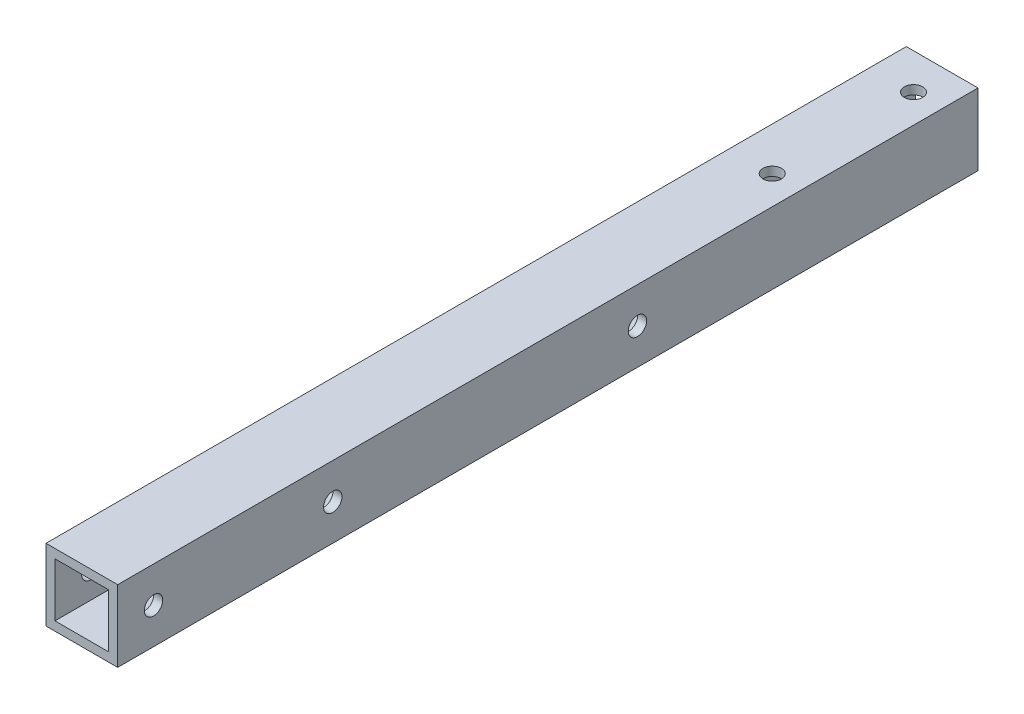
ISO-10303-21;
HEADER;
FILE_DESCRIPTION(('STEP AP214'),'2;1');
FILE_NAME('part.step','',(''),(''),'','','');
FILE_SCHEMA(('AUTOMOTIVE_DESIGN { 1 0 10303 214 1 1 1 1 }'));
ENDSEC;
DATA;
#1=APPLICATION_CONTEXT('core data for automotive mechanical design processes');
#2=APPLICATION_PROTOCOL_DEFINITION('international standard','automotive_design',2000,#1);
#3=PRODUCT_CONTEXT('',#1,'mechanical');
#4=PRODUCT('Part','Part','',(#3));
#5=PRODUCT_RELATED_PRODUCT_CATEGORY('part','',(#4));
#6=PRODUCT_DEFINITION_FORMATION('','',#4);
#7=PRODUCT_DEFINITION_CONTEXT('part definition',#1,'design');
#8=PRODUCT_DEFINITION('design','',#6,#7);
#9=PRODUCT_DEFINITION_SHAPE('','',#8);
#10=(LENGTH_UNIT() NAMED_UNIT(*) SI_UNIT(.MILLI.,.METRE.));
#11=(NAMED_UNIT(*) PLANE_ANGLE_UNIT() SI_UNIT($,.RADIAN.));
#12=(NAMED_UNIT(*) SI_UNIT($,.STERADIAN.) SOLID_ANGLE_UNIT());
#13=UNCERTAINTY_MEASURE_WITH_UNIT(LENGTH_MEASURE(1.E-05),#10,'distance_accuracy_value','');
#14=(GEOMETRIC_REPRESENTATION_CONTEXT(3) GLOBAL_UNCERTAINTY_ASSIGNED_CONTEXT((#13)) GLOBAL_UNIT_ASSIGNED_CONTEXT((#10,
#11,#12)) REPRESENTATION_CONTEXT('',''));
#15=CARTESIAN_POINT('',(0.,0.,0.));
#16=DIRECTION('',(0.,0.,1.));
#17=DIRECTION('',(1.,0.,0.));
#18=AXIS2_PLACEMENT_3D('',#15,#16,#17);
#19=CARTESIAN_POINT('',(0.,0.,304.8));
#20=DIRECTION('',(0.,0.,-1.));
#21=DIRECTION('',(-1.,0.,0.));
#22=AXIS2_PLACEMENT_3D('',#19,#20,#21);
#23=PLANE('',#22);
#24=DIRECTION('',(-1.,0.,0.));
#25=VECTOR('',#24,1.);
#26=CARTESIAN_POINT('',(12.7000000000001,-12.7,304.8));
#27=LINE('',#26,#25);
#28=CARTESIAN_POINT('',(12.7000000000001,-12.7,304.8));
#29=VERTEX_POINT('',#28);
#30=CARTESIAN_POINT('',(-12.6999999999999,-12.7,304.8));
#31=VERTEX_POINT('',#30);
#32=EDGE_CURVE('E142',#29,#31,#27,.T.);
#33=ORIENTED_EDGE('',*,*,#32,.F.);
#34=DIRECTION('',(0.,1.,0.));
#35=VECTOR('',#34,1.);
#36=CARTESIAN_POINT('',(12.7000000000001,-12.7,304.8));
#37=LINE('',#36,#35);
#38=CARTESIAN_POINT('',(12.7000000000001,12.7,304.8));
#39=VERTEX_POINT('',#38);
#40=EDGE_CURVE('E151',#29,#39,#37,.T.);
#41=ORIENTED_EDGE('',*,*,#40,.T.);
#42=DIRECTION('',(-1.,0.,0.));
#43=VECTOR('',#42,1.);
#44=CARTESIAN_POINT('',(12.7000000000001,12.7,304.8));
#45=LINE('',#44,#43);
#46=CARTESIAN_POINT('',(-12.6999999999999,12.7,304.8));
#47=VERTEX_POINT('',#46);
#48=EDGE_CURVE('E149',#39,#47,#45,.T.);
#49=ORIENTED_EDGE('',*,*,#48,.T.);
#50=DIRECTION('',(0.,1.,0.));
#51=VECTOR('',#50,1.);
#52=CARTESIAN_POINT('',(-12.6999999999999,-12.7,304.8));
#53=LINE('',#52,#51);
#54=EDGE_CURVE('E145',#31,#47,#53,.T.);
#55=ORIENTED_EDGE('',*,*,#54,.F.);
#56=EDGE_LOOP('',(#33,#41,#49,#55));
#57=FACE_BOUND('',#56,.T.);
#58=DIRECTION('',(0.,1.,0.));
#59=VECTOR('',#58,1.);
#60=CARTESIAN_POINT('',(9.52500000000005,-9.52499999999999,304.8));
#61=LINE('',#60,#59);
#62=CARTESIAN_POINT('',(9.52500000000005,-9.52499999999999,304.8));
#63=VERTEX_POINT('',#62);
#64=CARTESIAN_POINT('',(9.52500000000005,9.52499999999999,304.8));
#65=VERTEX_POINT('',#64);
#66=EDGE_CURVE('E104',#63,#65,#61,.T.);
#67=ORIENTED_EDGE('',*,*,#66,.F.);
#68=DIRECTION('',(1.,0.,0.));
#69=VECTOR('',#68,1.);
#70=CARTESIAN_POINT('',(-9.52500000000006,-9.52499999999999,304.8));
#71=LINE('',#70,#69);
#72=CARTESIAN_POINT('',(-9.52500000000006,-9.52499999999999,304.8));
#73=VERTEX_POINT('',#72);
#74=EDGE_CURVE('E126',#73,#63,#71,.T.);
#75=ORIENTED_EDGE('',*,*,#74,.F.);
#76=DIRECTION('',(0.,-1.,0.));
#77=VECTOR('',#76,1.);
#78=CARTESIAN_POINT('',(-9.52500000000006,-9.52499999999999,304.8));
#79=LINE('',#78,#77);
#80=CARTESIAN_POINT('',(-9.52500000000006,9.52499999999999,304.8));
#81=VERTEX_POINT('',#80);
#82=EDGE_CURVE('E124',#81,#73,#79,.T.);
#83=ORIENTED_EDGE('',*,*,#82,.F.);
#84=DIRECTION('',(-1.,0.,0.));
#85=VECTOR('',#84,1.);
#86=CARTESIAN_POINT('',(-9.52500000000006,9.52499999999999,304.8));
#87=LINE('',#86,#85);
#88=EDGE_CURVE('E112',#65,#81,#87,.T.);
#89=ORIENTED_EDGE('',*,*,#88,.F.);
#90=EDGE_LOOP('',(#67,#75,#83,#89));
#91=FACE_BOUND('',#90,.T.);
#92=ADVANCED_FACE('F38',(#57,#91),#23,.F.);
#93=CARTESIAN_POINT('',(0.,0.,0.));
#94=DIRECTION('',(0.,0.,-1.));
#95=DIRECTION('',(-1.,0.,0.));
#96=AXIS2_PLACEMENT_3D('',#93,#94,#95);
#97=PLANE('',#96);
#98=DIRECTION('',(-1.,0.,0.));
#99=VECTOR('',#98,1.);
#100=CARTESIAN_POINT('',(12.7000000000001,-12.7,0.));
#101=LINE('',#100,#99);
#102=CARTESIAN_POINT('',(12.7000000000001,-12.7,0.));
#103=VERTEX_POINT('',#102);
#104=CARTESIAN_POINT('',(-12.6999999999999,-12.7,0.));
#105=VERTEX_POINT('',#104);
#106=EDGE_CURVE('E120',#103,#105,#101,.T.);
#107=ORIENTED_EDGE('',*,*,#106,.T.);
#108=DIRECTION('',(0.,1.,0.));
#109=VECTOR('',#108,1.);
#110=CARTESIAN_POINT('',(-12.6999999999999,-12.7,0.));
#111=LINE('',#110,#109);
#112=CARTESIAN_POINT('',(-12.6999999999999,12.7,0.));
#113=VERTEX_POINT('',#112);
#114=EDGE_CURVE('E156',#105,#113,#111,.T.);
#115=ORIENTED_EDGE('',*,*,#114,.T.);
#116=DIRECTION('',(-1.,0.,0.));
#117=VECTOR('',#116,1.);
#118=CARTESIAN_POINT('',(12.7000000000001,12.7,0.));
#119=LINE('',#118,#117);
#120=CARTESIAN_POINT('',(12.7000000000001,12.7,0.));
#121=VERTEX_POINT('',#120);
#122=EDGE_CURVE('E159',#121,#113,#119,.T.);
#123=ORIENTED_EDGE('',*,*,#122,.F.);
#124=DIRECTION('',(0.,1.,0.));
#125=VECTOR('',#124,1.);
#126=CARTESIAN_POINT('',(12.7000000000001,-12.7,0.));
#127=LINE('',#126,#125);
#128=EDGE_CURVE('E146',#103,#121,#127,.T.);
#129=ORIENTED_EDGE('',*,*,#128,.F.);
#130=EDGE_LOOP('',(#107,#115,#123,#129));
#131=FACE_BOUND('',#130,.T.);
#132=DIRECTION('',(1.,0.,0.));
#133=VECTOR('',#132,1.);
#134=CARTESIAN_POINT('',(-9.52500000000006,-9.52499999999999,0.));
#135=LINE('',#134,#133);
#136=CARTESIAN_POINT('',(-9.52500000000006,-9.52499999999999,0.));
#137=VERTEX_POINT('',#136);
#138=CARTESIAN_POINT('',(9.52500000000005,-9.52499999999999,0.));
#139=VERTEX_POINT('',#138);
#140=EDGE_CURVE('E113',#137,#139,#135,.T.);
#141=ORIENTED_EDGE('',*,*,#140,.T.);
#142=DIRECTION('',(0.,1.,0.));
#143=VECTOR('',#142,1.);
#144=CARTESIAN_POINT('',(9.52500000000005,-9.52499999999999,0.));
#145=LINE('',#144,#143);
#146=CARTESIAN_POINT('',(9.52500000000005,9.52499999999999,0.));
#147=VERTEX_POINT('',#146);
#148=EDGE_CURVE('E63',#139,#147,#145,.T.);
#149=ORIENTED_EDGE('',*,*,#148,.T.);
#150=DIRECTION('',(-1.,0.,0.));
#151=VECTOR('',#150,1.);
#152=CARTESIAN_POINT('',(-9.52500000000006,9.52499999999999,0.));
#153=LINE('',#152,#151);
#154=CARTESIAN_POINT('',(-9.52500000000006,9.52499999999999,0.));
#155=VERTEX_POINT('',#154);
#156=EDGE_CURVE('E119',#147,#155,#153,.T.);
#157=ORIENTED_EDGE('',*,*,#156,.T.);
#158=DIRECTION('',(0.,-1.,0.));
#159=VECTOR('',#158,1.);
#160=CARTESIAN_POINT('',(-9.52500000000006,-9.52499999999999,0.));
#161=LINE('',#160,#159);
#162=EDGE_CURVE('E134',#155,#137,#161,.T.);
#163=ORIENTED_EDGE('',*,*,#162,.T.);
#164=EDGE_LOOP('',(#141,#149,#157,#163));
#165=FACE_BOUND('',#164,.T.);
#166=ADVANCED_FACE('F227',(#131,#165),#97,.T.);
#167=CARTESIAN_POINT('',(12.7000000000001,-12.7,304.8));
#168=DIRECTION('',(0.,-1.,0.));
#169=DIRECTION('',(0.,0.,-1.));
#170=AXIS2_PLACEMENT_3D('',#167,#168,#169);
#171=PLANE('',#170);
#172=CARTESIAN_POINT('',(2.54000000000007,-12.7,62.738));
#173=DIRECTION('',(0.,-1.,0.));
#174=DIRECTION('',(0.,0.,-1.));
#175=AXIS2_PLACEMENT_3D('',#172,#173,#174);
#176=CIRCLE('',#175,3.2639);
#177=CARTESIAN_POINT('',(2.54000000000007,-12.7,66.0019));
#178=VERTEX_POINT('',#177);
#179=EDGE_CURVE('E212',#178,#178,#176,.T.);
#180=ORIENTED_EDGE('',*,*,#179,.F.);
#181=EDGE_LOOP('',(#180));
#182=FACE_BOUND('',#181,.T.);
#183=CARTESIAN_POINT('',(2.54000000000007,-12.7,12.7));
#184=DIRECTION('',(0.,-1.,0.));
#185=DIRECTION('',(0.,0.,-1.));
#186=AXIS2_PLACEMENT_3D('',#183,#184,#185);
#187=CIRCLE('',#186,3.2639);
#188=CARTESIAN_POINT('',(2.54000000000007,-12.7,15.9639));
#189=VERTEX_POINT('',#188);
#190=EDGE_CURVE('E132',#189,#189,#187,.T.);
#191=ORIENTED_EDGE('',*,*,#190,.F.);
#192=EDGE_LOOP('',(#191));
#193=FACE_BOUND('',#192,.T.);
#194=ORIENTED_EDGE('',*,*,#106,.F.);
#195=DIRECTION('',(0.,0.,-1.));
#196=VECTOR('',#195,1.);
#197=CARTESIAN_POINT('',(12.7000000000001,-12.7,304.8));
#198=LINE('',#197,#196);
#199=EDGE_CURVE('E11',#29,#103,#198,.T.);
#200=ORIENTED_EDGE('',*,*,#199,.F.);
#201=ORIENTED_EDGE('',*,*,#32,.T.);
#202=DIRECTION('',(0.,0.,-1.));
#203=VECTOR('',#202,1.);
#204=CARTESIAN_POINT('',(-12.6999999999999,-12.7,304.8));
#205=LINE('',#204,#203);
#206=EDGE_CURVE('E153',#31,#105,#205,.T.);
#207=ORIENTED_EDGE('',*,*,#206,.T.);
#208=EDGE_LOOP('',(#194,#200,#201,#207));
#209=FACE_BOUND('',#208,.T.);
#210=ADVANCED_FACE('F40',(#182,#193,#209),#171,.T.);
#211=CARTESIAN_POINT('',(12.7000000000001,-12.7,304.8));
#212=DIRECTION('',(-1.,0.,0.));
#213=DIRECTION('',(0.,0.,1.));
#214=AXIS2_PLACEMENT_3D('',#211,#212,#213);
#215=PLANE('',#214);
#216=CARTESIAN_POINT('',(12.7000000000001,0.,120.65));
#217=DIRECTION('',(-1.,0.,0.));
#218=DIRECTION('',(0.,0.,1.));
#219=AXIS2_PLACEMENT_3D('',#216,#217,#218);
#220=CIRCLE('',#219,3.26390000000001);
#221=CARTESIAN_POINT('',(12.7000000000001,0.,123.9139));
#222=VERTEX_POINT('',#221);
#223=EDGE_CURVE('E273',#222,#222,#220,.T.);
#224=ORIENTED_EDGE('',*,*,#223,.T.);
#225=EDGE_LOOP('',(#224));
#226=FACE_BOUND('',#225,.T.);
#227=CARTESIAN_POINT('',(12.7000000000001,0.,228.6));
#228=DIRECTION('',(1.,0.,0.));
#229=DIRECTION('',(0.,0.,-1.));
#230=AXIS2_PLACEMENT_3D('',#227,#228,#229);
#231=CIRCLE('',#230,3.26389999999998);
#232=CARTESIAN_POINT('',(12.7000000000001,0.,225.3361));
#233=VERTEX_POINT('',#232);
#234=EDGE_CURVE('E192',#233,#233,#231,.T.);
#235=ORIENTED_EDGE('',*,*,#234,.F.);
#236=EDGE_LOOP('',(#235));
#237=FACE_BOUND('',#236,.T.);
#238=CARTESIAN_POINT('',(12.7000000000001,0.,292.1));
#239=DIRECTION('',(-1.,0.,0.));
#240=DIRECTION('',(0.,0.,1.));
#241=AXIS2_PLACEMENT_3D('',#238,#239,#240);
#242=CIRCLE('',#241,3.26390000000001);
#243=CARTESIAN_POINT('',(12.7000000000001,0.,295.3639));
#244=VERTEX_POINT('',#243);
#245=EDGE_CURVE('E181',#244,#244,#242,.T.);
#246=ORIENTED_EDGE('',*,*,#245,.T.);
#247=EDGE_LOOP('',(#246));
#248=FACE_BOUND('',#247,.T.);
#249=ORIENTED_EDGE('',*,*,#128,.T.);
#250=DIRECTION('',(0.,0.,-1.));
#251=VECTOR('',#250,1.);
#252=CARTESIAN_POINT('',(12.7000000000001,12.7,304.8));
#253=LINE('',#252,#251);
#254=EDGE_CURVE('E47',#39,#121,#253,.T.);
#255=ORIENTED_EDGE('',*,*,#254,.F.);
#256=ORIENTED_EDGE('',*,*,#40,.F.);
#257=ORIENTED_EDGE('',*,*,#199,.T.);
#258=EDGE_LOOP('',(#249,#255,#256,#257));
#259=FACE_BOUND('',#258,.T.);
#260=ADVANCED_FACE('F226',(#226,#237,#248,#259),#215,.F.);
#261=CARTESIAN_POINT('',(12.7000000000001,12.7,304.8));
#262=DIRECTION('',(0.,-1.,0.));
#263=DIRECTION('',(0.,0.,-1.));
#264=AXIS2_PLACEMENT_3D('',#261,#262,#263);
#265=PLANE('',#264);
#266=CARTESIAN_POINT('',(2.54000000000007,12.7,62.738));
#267=DIRECTION('',(0.,1.,0.));
#268=DIRECTION('',(0.,0.,1.));
#269=AXIS2_PLACEMENT_3D('',#266,#267,#268);
#270=CIRCLE('',#269,3.2639);
#271=CARTESIAN_POINT('',(2.54000000000007,12.7,66.0019));
#272=VERTEX_POINT('',#271);
#273=EDGE_CURVE('E177',#272,#272,#270,.T.);
#274=ORIENTED_EDGE('',*,*,#273,.F.);
#275=EDGE_LOOP('',(#274));
#276=FACE_BOUND('',#275,.T.);
#277=CARTESIAN_POINT('',(2.54000000000007,12.7,12.7));
#278=DIRECTION('',(0.,1.,0.));
#279=DIRECTION('',(0.,0.,1.));
#280=AXIS2_PLACEMENT_3D('',#277,#278,#279);
#281=CIRCLE('',#280,3.2639);
#282=CARTESIAN_POINT('',(2.54000000000007,12.7,15.9639));
#283=VERTEX_POINT('',#282);
#284=EDGE_CURVE('E172',#283,#283,#281,.T.);
#285=ORIENTED_EDGE('',*,*,#284,.F.);
#286=EDGE_LOOP('',(#285));
#287=FACE_BOUND('',#286,.T.);
#288=ORIENTED_EDGE('',*,*,#122,.T.);
#289=DIRECTION('',(0.,0.,-1.));
#290=VECTOR('',#289,1.);
#291=CARTESIAN_POINT('',(-12.6999999999999,12.7,304.8));
#292=LINE('',#291,#290);
#293=EDGE_CURVE('E165',#47,#113,#292,.T.);
#294=ORIENTED_EDGE('',*,*,#293,.F.);
#295=ORIENTED_EDGE('',*,*,#48,.F.);
#296=ORIENTED_EDGE('',*,*,#254,.T.);
#297=EDGE_LOOP('',(#288,#294,#295,#296));
#298=FACE_BOUND('',#297,.T.);
#299=ADVANCED_FACE('F240',(#276,#287,#298),#265,.F.);
#300=CARTESIAN_POINT('',(-12.6999999999999,-12.7,304.8));
#301=DIRECTION('',(-1.,0.,0.));
#302=DIRECTION('',(0.,0.,1.));
#303=AXIS2_PLACEMENT_3D('',#300,#301,#302);
#304=PLANE('',#303);
#305=CARTESIAN_POINT('',(-12.6999999999999,0.,120.65));
#306=DIRECTION('',(-1.,0.,0.));
#307=DIRECTION('',(0.,0.,1.));
#308=AXIS2_PLACEMENT_3D('',#305,#306,#307);
#309=CIRCLE('',#308,3.26390000000001);
#310=CARTESIAN_POINT('',(-12.6999999999999,0.,123.9139));
#311=VERTEX_POINT('',#310);
#312=EDGE_CURVE('E409',#311,#311,#309,.T.);
#313=ORIENTED_EDGE('',*,*,#312,.F.);
#314=EDGE_LOOP('',(#313));
#315=FACE_BOUND('',#314,.T.);
#316=CARTESIAN_POINT('',(-12.6999999999999,0.,228.6));
#317=DIRECTION('',(1.,0.,0.));
#318=DIRECTION('',(0.,0.,-1.));
#319=AXIS2_PLACEMENT_3D('',#316,#317,#318);
#320=CIRCLE('',#319,3.26389999999998);
#321=CARTESIAN_POINT('',(-12.6999999999999,0.,225.3361));
#322=VERTEX_POINT('',#321);
#323=EDGE_CURVE('E185',#322,#322,#320,.T.);
#324=ORIENTED_EDGE('',*,*,#323,.T.);
#325=EDGE_LOOP('',(#324));
#326=FACE_BOUND('',#325,.T.);
#327=CARTESIAN_POINT('',(-12.6999999999999,0.,292.1));
#328=DIRECTION('',(-1.,0.,0.));
#329=DIRECTION('',(0.,0.,1.));
#330=AXIS2_PLACEMENT_3D('',#327,#328,#329);
#331=CIRCLE('',#330,3.26390000000001);
#332=CARTESIAN_POINT('',(-12.6999999999999,0.,295.3639));
#333=VERTEX_POINT('',#332);
#334=EDGE_CURVE('E189',#333,#333,#331,.T.);
#335=ORIENTED_EDGE('',*,*,#334,.F.);
#336=EDGE_LOOP('',(#335));
#337=FACE_BOUND('',#336,.T.);
#338=ORIENTED_EDGE('',*,*,#114,.F.);
#339=ORIENTED_EDGE('',*,*,#206,.F.);
#340=ORIENTED_EDGE('',*,*,#54,.T.);
#341=ORIENTED_EDGE('',*,*,#293,.T.);
#342=EDGE_LOOP('',(#338,#339,#340,#341));
#343=FACE_BOUND('',#342,.T.);
#344=ADVANCED_FACE('F246',(#315,#326,#337,#343),#304,.T.);
#345=CARTESIAN_POINT('',(9.52500000000005,-9.52499999999999,304.8));
#346=DIRECTION('',(-1.,0.,0.));
#347=DIRECTION('',(0.,0.,1.));
#348=AXIS2_PLACEMENT_3D('',#345,#346,#347);
#349=PLANE('',#348);
#350=CARTESIAN_POINT('',(9.52500000000005,0.,120.65));
#351=DIRECTION('',(-1.,0.,0.));
#352=DIRECTION('',(0.,0.,1.));
#353=AXIS2_PLACEMENT_3D('',#350,#351,#352);
#354=CIRCLE('',#353,3.26390000000001);
#355=CARTESIAN_POINT('',(9.52500000000005,0.,123.9139));
#356=VERTEX_POINT('',#355);
#357=EDGE_CURVE('E197',#356,#356,#354,.T.);
#358=ORIENTED_EDGE('',*,*,#357,.F.);
#359=EDGE_LOOP('',(#358));
#360=FACE_BOUND('',#359,.T.);
#361=CARTESIAN_POINT('',(9.52500000000006,0.,228.6));
#362=DIRECTION('',(-1.,0.,0.));
#363=DIRECTION('',(0.,0.,1.));
#364=AXIS2_PLACEMENT_3D('',#361,#362,#363);
#365=CIRCLE('',#364,3.26389999999998);
#366=CARTESIAN_POINT('',(9.52500000000006,0.,231.8639));
#367=VERTEX_POINT('',#366);
#368=EDGE_CURVE('E184',#367,#367,#365,.T.);
#369=ORIENTED_EDGE('',*,*,#368,.F.);
#370=EDGE_LOOP('',(#369));
#371=FACE_BOUND('',#370,.T.);
#372=CARTESIAN_POINT('',(9.52500000000005,0.,292.1));
#373=DIRECTION('',(-1.,0.,0.));
#374=DIRECTION('',(0.,0.,1.));
#375=AXIS2_PLACEMENT_3D('',#372,#373,#374);
#376=CIRCLE('',#375,3.26390000000001);
#377=CARTESIAN_POINT('',(9.52500000000005,0.,295.3639));
#378=VERTEX_POINT('',#377);
#379=EDGE_CURVE('E180',#378,#378,#376,.T.);
#380=ORIENTED_EDGE('',*,*,#379,.F.);
#381=EDGE_LOOP('',(#380));
#382=FACE_BOUND('',#381,.T.);
#383=ORIENTED_EDGE('',*,*,#148,.F.);
#384=DIRECTION('',(0.,0.,-1.));
#385=VECTOR('',#384,1.);
#386=CARTESIAN_POINT('',(9.52500000000005,-9.52499999999999,304.8));
#387=LINE('',#386,#385);
#388=EDGE_CURVE('E108',#63,#139,#387,.T.);
#389=ORIENTED_EDGE('',*,*,#388,.F.);
#390=ORIENTED_EDGE('',*,*,#66,.T.);
#391=DIRECTION('',(0.,0.,-1.));
#392=VECTOR('',#391,1.);
#393=CARTESIAN_POINT('',(9.52500000000005,9.52499999999999,304.8));
#394=LINE('',#393,#392);
#395=EDGE_CURVE('E107',#65,#147,#394,.T.);
#396=ORIENTED_EDGE('',*,*,#395,.T.);
#397=EDGE_LOOP('',(#383,#389,#390,#396));
#398=FACE_BOUND('',#397,.T.);
#399=ADVANCED_FACE('F106',(#360,#371,#382,#398),#349,.T.);
#400=CARTESIAN_POINT('',(-9.52500000000006,9.52499999999999,304.8));
#401=DIRECTION('',(0.,-1.,0.));
#402=DIRECTION('',(0.,0.,-1.));
#403=AXIS2_PLACEMENT_3D('',#400,#401,#402);
#404=PLANE('',#403);
#405=CARTESIAN_POINT('',(2.54000000000007,9.52499999999995,62.738));
#406=DIRECTION('',(0.,-1.,0.));
#407=DIRECTION('',(0.,0.,-1.));
#408=AXIS2_PLACEMENT_3D('',#405,#406,#407);
#409=CIRCLE('',#408,3.2639);
#410=CARTESIAN_POINT('',(2.54000000000007,9.52499999999995,66.0019));
#411=VERTEX_POINT('',#410);
#412=EDGE_CURVE('E176',#411,#411,#409,.T.);
#413=ORIENTED_EDGE('',*,*,#412,.F.);
#414=EDGE_LOOP('',(#413));
#415=FACE_BOUND('',#414,.T.);
#416=CARTESIAN_POINT('',(2.54000000000007,9.52499999999995,12.7));
#417=DIRECTION('',(0.,-1.,0.));
#418=DIRECTION('',(0.,0.,-1.));
#419=AXIS2_PLACEMENT_3D('',#416,#417,#418);
#420=CIRCLE('',#419,3.2639);
#421=CARTESIAN_POINT('',(2.54000000000007,9.52499999999995,15.9639));
#422=VERTEX_POINT('',#421);
#423=EDGE_CURVE('E171',#422,#422,#420,.T.);
#424=ORIENTED_EDGE('',*,*,#423,.F.);
#425=EDGE_LOOP('',(#424));
#426=FACE_BOUND('',#425,.T.);
#427=ORIENTED_EDGE('',*,*,#156,.F.);
#428=ORIENTED_EDGE('',*,*,#395,.F.);
#429=ORIENTED_EDGE('',*,*,#88,.T.);
#430=DIRECTION('',(0.,0.,-1.));
#431=VECTOR('',#430,1.);
#432=CARTESIAN_POINT('',(-9.52500000000006,9.52499999999999,304.8));
#433=LINE('',#432,#431);
#434=EDGE_CURVE('E121',#81,#155,#433,.T.);
#435=ORIENTED_EDGE('',*,*,#434,.T.);
#436=EDGE_LOOP('',(#427,#428,#429,#435));
#437=FACE_BOUND('',#436,.T.);
#438=ADVANCED_FACE('F116',(#415,#426,#437),#404,.T.);
#439=CARTESIAN_POINT('',(-9.52500000000006,-9.52499999999999,304.8));
#440=DIRECTION('',(1.,0.,0.));
#441=DIRECTION('',(0.,0.,-1.));
#442=AXIS2_PLACEMENT_3D('',#439,#440,#441);
#443=PLANE('',#442);
#444=CARTESIAN_POINT('',(-9.52500000000006,0.,120.65));
#445=DIRECTION('',(1.,0.,0.));
#446=DIRECTION('',(0.,0.,-1.));
#447=AXIS2_PLACEMENT_3D('',#444,#445,#446);
#448=CIRCLE('',#447,3.26390000000001);
#449=CARTESIAN_POINT('',(-9.52500000000006,0.,117.3861));
#450=VERTEX_POINT('',#449);
#451=EDGE_CURVE('E42',#450,#450,#448,.T.);
#452=ORIENTED_EDGE('',*,*,#451,.F.);
#453=EDGE_LOOP('',(#452));
#454=FACE_BOUND('',#453,.T.);
#455=CARTESIAN_POINT('',(-9.52500000000006,0.,228.6));
#456=DIRECTION('',(1.,0.,0.));
#457=DIRECTION('',(0.,0.,-1.));
#458=AXIS2_PLACEMENT_3D('',#455,#456,#457);
#459=CIRCLE('',#458,3.26389999999998);
#460=CARTESIAN_POINT('',(-9.52500000000006,0.,225.3361));
#461=VERTEX_POINT('',#460);
#462=EDGE_CURVE('E182',#461,#461,#459,.T.);
#463=ORIENTED_EDGE('',*,*,#462,.F.);
#464=EDGE_LOOP('',(#463));
#465=FACE_BOUND('',#464,.T.);
#466=CARTESIAN_POINT('',(-9.52500000000006,0.,292.1));
#467=DIRECTION('',(1.,0.,0.));
#468=DIRECTION('',(0.,0.,-1.));
#469=AXIS2_PLACEMENT_3D('',#466,#467,#468);
#470=CIRCLE('',#469,3.26390000000001);
#471=CARTESIAN_POINT('',(-9.52500000000006,0.,288.8361));
#472=VERTEX_POINT('',#471);
#473=EDGE_CURVE('E178',#472,#472,#470,.T.);
#474=ORIENTED_EDGE('',*,*,#473,.F.);
#475=EDGE_LOOP('',(#474));
#476=FACE_BOUND('',#475,.T.);
#477=ORIENTED_EDGE('',*,*,#162,.F.);
#478=ORIENTED_EDGE('',*,*,#434,.F.);
#479=ORIENTED_EDGE('',*,*,#82,.T.);
#480=DIRECTION('',(0.,0.,-1.));
#481=VECTOR('',#480,1.);
#482=CARTESIAN_POINT('',(-9.52500000000006,-9.52499999999999,304.8));
#483=LINE('',#482,#481);
#484=EDGE_CURVE('E55',#73,#137,#483,.T.);
#485=ORIENTED_EDGE('',*,*,#484,.T.);
#486=EDGE_LOOP('',(#477,#478,#479,#485));
#487=FACE_BOUND('',#486,.T.);
#488=ADVANCED_FACE('F304',(#454,#465,#476,#487),#443,.T.);
#489=CARTESIAN_POINT('',(-9.52500000000006,-9.52499999999999,304.8));
#490=DIRECTION('',(0.,1.,0.));
#491=DIRECTION('',(0.,0.,1.));
#492=AXIS2_PLACEMENT_3D('',#489,#490,#491);
#493=PLANE('',#492);
#494=CARTESIAN_POINT('',(2.54000000000007,-9.52500000000006,62.738));
#495=DIRECTION('',(0.,1.,0.));
#496=DIRECTION('',(0.,0.,1.));
#497=AXIS2_PLACEMENT_3D('',#494,#495,#496);
#498=CIRCLE('',#497,3.2639);
#499=CARTESIAN_POINT('',(2.54000000000007,-9.52500000000006,66.0019));
#500=VERTEX_POINT('',#499);
#501=EDGE_CURVE('E173',#500,#500,#498,.T.);
#502=ORIENTED_EDGE('',*,*,#501,.F.);
#503=EDGE_LOOP('',(#502));
#504=FACE_BOUND('',#503,.T.);
#505=CARTESIAN_POINT('',(2.54000000000007,-9.52500000000006,12.7));
#506=DIRECTION('',(0.,1.,0.));
#507=DIRECTION('',(0.,0.,1.));
#508=AXIS2_PLACEMENT_3D('',#505,#506,#507);
#509=CIRCLE('',#508,3.2639);
#510=CARTESIAN_POINT('',(2.54000000000007,-9.52500000000006,15.9639));
#511=VERTEX_POINT('',#510);
#512=EDGE_CURVE('E168',#511,#511,#509,.T.);
#513=ORIENTED_EDGE('',*,*,#512,.F.);
#514=EDGE_LOOP('',(#513));
#515=FACE_BOUND('',#514,.T.);
#516=ORIENTED_EDGE('',*,*,#140,.F.);
#517=ORIENTED_EDGE('',*,*,#484,.F.);
#518=ORIENTED_EDGE('',*,*,#74,.T.);
#519=ORIENTED_EDGE('',*,*,#388,.T.);
#520=EDGE_LOOP('',(#516,#517,#518,#519));
#521=FACE_BOUND('',#520,.T.);
#522=ADVANCED_FACE('F301',(#504,#515,#521),#493,.T.);
#523=CARTESIAN_POINT('',(2.54000000000007,-292.1,12.7));
#524=DIRECTION('',(0.,1.,0.));
#525=DIRECTION('',(0.,0.,1.));
#526=AXIS2_PLACEMENT_3D('',#523,#524,#525);
#527=CYLINDRICAL_SURFACE('',#526,3.2639);
#528=CARTESIAN_POINT('',(2.54000000000007,-12.7,15.9639));
#529=CARTESIAN_POINT('',(2.54000000000007,-12.6669270833333,15.9639));
#530=CARTESIAN_POINT('',(2.54000000000007,-12.6338541666666,15.9639));
#531=CARTESIAN_POINT('',(2.54000000000007,-12.5677083333333,15.9639));
#532=CARTESIAN_POINT('',(2.54000000000007,-12.5346354166667,15.9639));
#533=CARTESIAN_POINT('',(2.54000000000007,-12.4684895833333,15.9639));
#534=CARTESIAN_POINT('',(2.54000000000007,-12.4354166666667,15.9639));
#535=CARTESIAN_POINT('',(2.54000000000007,-12.3692708333333,15.9639));
#536=CARTESIAN_POINT('',(2.54000000000007,-12.3361979166667,15.9639));
#537=CARTESIAN_POINT('',(2.54000000000007,-12.2700520833334,15.9639));
#538=CARTESIAN_POINT('',(2.54000000000007,-12.2369791666667,15.9639));
#539=CARTESIAN_POINT('',(2.54000000000007,-12.1708333333333,15.9639));
#540=CARTESIAN_POINT('',(2.54000000000007,-12.1377604166667,15.9639));
#541=CARTESIAN_POINT('',(2.54000000000007,-12.0716145833333,15.9639));
#542=CARTESIAN_POINT('',(2.54000000000007,-12.0385416666667,15.9639));
#543=CARTESIAN_POINT('',(2.54000000000007,-11.9723958333334,15.9639));
#544=CARTESIAN_POINT('',(2.54000000000007,-11.9393229166667,15.9639));
#545=CARTESIAN_POINT('',(2.54000000000007,-11.8731770833333,15.9639));
#546=CARTESIAN_POINT('',(2.54000000000007,-11.8401041666667,15.9639));
#547=CARTESIAN_POINT('',(2.54000000000007,-11.7739583333333,15.9639));
#548=CARTESIAN_POINT('',(2.54000000000007,-11.7408854166667,15.9639));
#549=CARTESIAN_POINT('',(2.54000000000007,-11.6747395833334,15.9639));
#550=CARTESIAN_POINT('',(2.54000000000007,-11.6416666666667,15.9639));
#551=CARTESIAN_POINT('',(2.54000000000007,-11.5755208333333,15.9639));
#552=CARTESIAN_POINT('',(2.54000000000007,-11.5424479166667,15.9639));
#553=CARTESIAN_POINT('',(2.54000000000007,-11.4763020833333,15.9639));
#554=CARTESIAN_POINT('',(2.54000000000007,-11.4432291666667,15.9639));
#555=CARTESIAN_POINT('',(2.54000000000007,-11.3770833333334,15.9639));
#556=CARTESIAN_POINT('',(2.54000000000007,-11.3440104166667,15.9639));
#557=CARTESIAN_POINT('',(2.54000000000007,-11.2778645833334,15.9639));
#558=CARTESIAN_POINT('',(2.54000000000007,-11.2447916666667,15.9639));
#559=CARTESIAN_POINT('',(2.54000000000007,-11.1786458333334,15.9639));
#560=CARTESIAN_POINT('',(2.54000000000007,-11.1455729166667,15.9639));
#561=CARTESIAN_POINT('',(2.54000000000007,-11.0794270833334,15.9639));
#562=CARTESIAN_POINT('',(2.54000000000007,-11.0463541666667,15.9639));
#563=CARTESIAN_POINT('',(2.54000000000007,-10.9802083333334,15.9639));
#564=CARTESIAN_POINT('',(2.54000000000007,-10.9471354166667,15.9639));
#565=CARTESIAN_POINT('',(2.54000000000007,-10.8809895833334,15.9639));
#566=CARTESIAN_POINT('',(2.54000000000007,-10.8479166666667,15.9639));
#567=CARTESIAN_POINT('',(2.54000000000007,-10.7817708333334,15.9639));
#568=CARTESIAN_POINT('',(2.54000000000007,-10.7486979166667,15.9639));
#569=CARTESIAN_POINT('',(2.54000000000007,-10.6825520833334,15.9639));
#570=CARTESIAN_POINT('',(2.54000000000007,-10.6494791666667,15.9639));
#571=CARTESIAN_POINT('',(2.54000000000007,-10.5833333333334,15.9639));
#572=CARTESIAN_POINT('',(2.54000000000007,-10.5502604166667,15.9639));
#573=CARTESIAN_POINT('',(2.54000000000007,-10.4841145833334,15.9639));
#574=CARTESIAN_POINT('',(2.54000000000007,-10.4510416666667,15.9639));
#575=CARTESIAN_POINT('',(2.54000000000007,-10.3848958333334,15.9639));
#576=CARTESIAN_POINT('',(2.54000000000007,-10.3518229166667,15.9639));
#577=CARTESIAN_POINT('',(2.54000000000007,-10.2856770833334,15.9639));
#578=CARTESIAN_POINT('',(2.54000000000007,-10.2526041666667,15.9639));
#579=CARTESIAN_POINT('',(2.54000000000007,-10.1864583333334,15.9639));
#580=CARTESIAN_POINT('',(2.54000000000007,-10.1533854166667,15.9639));
#581=CARTESIAN_POINT('',(2.54000000000007,-10.0872395833334,15.9639));
#582=CARTESIAN_POINT('',(2.54000000000007,-10.0541666666667,15.9639));
#583=CARTESIAN_POINT('',(2.54000000000007,-9.98802083333337,15.9639));
#584=CARTESIAN_POINT('',(2.54000000000007,-9.9549479166667,15.9639));
#585=CARTESIAN_POINT('',(2.54000000000007,-9.88880208333337,15.9639));
#586=CARTESIAN_POINT('',(2.54000000000007,-9.85572916666672,15.9639));
#587=CARTESIAN_POINT('',(2.54000000000007,-9.78958333333339,15.9639));
#588=CARTESIAN_POINT('',(2.54000000000007,-9.75651041666672,15.9639));
#589=CARTESIAN_POINT('',(2.54000000000007,-9.69036458333339,15.9639));
#590=CARTESIAN_POINT('',(2.54000000000007,-9.65729166666673,15.9639));
#591=CARTESIAN_POINT('',(2.54000000000007,-9.59114583333341,15.9639));
#592=CARTESIAN_POINT('',(2.54000000000007,-9.55807291666673,15.9639));
#593=CARTESIAN_POINT('',(2.54000000000007,-9.52500000000006,15.9639));
#594=B_SPLINE_CURVE_WITH_KNOTS('',3,(#528,#529,#530,#531,#532,#533,#534,#535,#536,#537,#538,
#539,#540,#541,#542,#543,#544,#545,#546,#547,#548,#549,#550,#551,#552,#553,#554,#555,#556,#557,
#558,#559,#560,#561,#562,#563,#564,#565,#566,#567,#568,#569,#570,#571,#572,#573,#574,#575,#576,
#577,#578,#579,#580,#581,#582,#583,#584,#585,#586,#587,#588,#589,#590,#591,#592,#593),
.UNSPECIFIED.,.F.,.F.,(4,2,2,2,2,2,2,2,2,2,2,2,2,2,2,2,2,2,2,2,2,2,2,2,2,2,2,2,2,2,2,2,4),(0.,
0.0992187500000186,0.198437499999982,0.29765625,0.396874999999963,0.496093749999982,0.5953125,
0.694531249999963,0.793749999999982,0.892968750000001,0.992187499999964,1.09140624999998,
1.190625,1.28984374999996,1.38906249999998,1.48828124999995,1.58749999999996,1.68671874999998,
1.78593749999995,1.88515624999996,1.98437499999993,2.08359374999995,2.18281249999996,
2.28203124999993,2.38124999999995,2.48046874999996,2.57968749999993,2.67890624999995,
2.77812499999996,2.87734374999993,2.97656249999995,3.07578124999991,3.17499999999993),.UNSPECIFIED.);
#595=EDGE_CURVE('BSEAM221',#189,#511,#594,.T.);
#596=ORIENTED_EDGE('',*,*,#190,.T.);
#597=ORIENTED_EDGE('',*,*,#512,.T.);
#598=ORIENTED_EDGE('',*,*,#595,.T.);
#599=ORIENTED_EDGE('',*,*,#595,.F.);
#600=EDGE_LOOP('',(#596,#598,#597,#599));
#601=FACE_BOUND('',#600,.T.);
#602=ADVANCED_FACE('F221',(#601),#527,.F.);
#603=CARTESIAN_POINT('',(2.54000000000007,9.52499999999995,15.9639));
#604=CARTESIAN_POINT('',(2.54000000000007,9.55807291666662,15.9639));
#605=CARTESIAN_POINT('',(2.54000000000007,9.59114583333329,15.9639));
#606=CARTESIAN_POINT('',(2.54000000000007,9.65729166666662,15.9639));
#607=CARTESIAN_POINT('',(2.54000000000007,9.69036458333328,15.9639));
#608=CARTESIAN_POINT('',(2.54000000000007,9.75651041666661,15.9639));
#609=CARTESIAN_POINT('',(2.54000000000007,9.78958333333328,15.9639));
#610=CARTESIAN_POINT('',(2.54000000000007,9.85572916666662,15.9639));
#611=CARTESIAN_POINT('',(2.54000000000007,9.8888020833333,15.9639));
#612=CARTESIAN_POINT('',(2.54000000000007,9.95494791666662,15.9639));
#613=CARTESIAN_POINT('',(2.54000000000007,9.98802083333328,15.9639));
#614=CARTESIAN_POINT('',(2.54000000000007,10.0541666666666,15.9639));
#615=CARTESIAN_POINT('',(2.54000000000007,10.0872395833333,15.9639));
#616=CARTESIAN_POINT('',(2.54000000000007,10.1533854166666,15.9639));
#617=CARTESIAN_POINT('',(2.54000000000007,10.1864583333333,15.9639));
#618=CARTESIAN_POINT('',(2.54000000000007,10.2526041666666,15.9639));
#619=CARTESIAN_POINT('',(2.54000000000007,10.2856770833333,15.9639));
#620=CARTESIAN_POINT('',(2.54000000000007,10.3518229166666,15.9639));
#621=CARTESIAN_POINT('',(2.54000000000007,10.3848958333333,15.9639));
#622=CARTESIAN_POINT('',(2.54000000000007,10.4510416666666,15.9639));
#623=CARTESIAN_POINT('',(2.54000000000007,10.4841145833333,15.9639));
#624=CARTESIAN_POINT('',(2.54000000000007,10.5502604166666,15.9639));
#625=CARTESIAN_POINT('',(2.54000000000007,10.5833333333333,15.9639));
#626=CARTESIAN_POINT('',(2.54000000000007,10.6494791666666,15.9639));
#627=CARTESIAN_POINT('',(2.54000000000007,10.6825520833333,15.9639));
#628=CARTESIAN_POINT('',(2.54000000000007,10.7486979166666,15.9639));
#629=CARTESIAN_POINT('',(2.54000000000007,10.7817708333333,15.9639));
#630=CARTESIAN_POINT('',(2.54000000000007,10.8479166666666,15.9639));
#631=CARTESIAN_POINT('',(2.54000000000007,10.8809895833333,15.9639));
#632=CARTESIAN_POINT('',(2.54000000000007,10.9471354166666,15.9639));
#633=CARTESIAN_POINT('',(2.54000000000007,10.9802083333333,15.9639));
#634=CARTESIAN_POINT('',(2.54000000000007,11.0463541666666,15.9639));
#635=CARTESIAN_POINT('',(2.54000000000007,11.0794270833333,15.9639));
#636=CARTESIAN_POINT('',(2.54000000000007,11.1455729166666,15.9639));
#637=CARTESIAN_POINT('',(2.54000000000007,11.1786458333333,15.9639));
#638=CARTESIAN_POINT('',(2.54000000000007,11.2447916666666,15.9639));
#639=CARTESIAN_POINT('',(2.54000000000007,11.2778645833333,15.9639));
#640=CARTESIAN_POINT('',(2.54000000000007,11.3440104166666,15.9639));
#641=CARTESIAN_POINT('',(2.54000000000007,11.3770833333333,15.9639));
#642=CARTESIAN_POINT('',(2.54000000000007,11.4432291666666,15.9639));
#643=CARTESIAN_POINT('',(2.54000000000007,11.4763020833333,15.9639));
#644=CARTESIAN_POINT('',(2.54000000000007,11.5424479166666,15.9639));
#645=CARTESIAN_POINT('',(2.54000000000007,11.5755208333333,15.9639));
#646=CARTESIAN_POINT('',(2.54000000000007,11.6416666666666,15.9639));
#647=CARTESIAN_POINT('',(2.54000000000007,11.6747395833333,15.9639));
#648=CARTESIAN_POINT('',(2.54000000000007,11.7408854166666,15.9639));
#649=CARTESIAN_POINT('',(2.54000000000007,11.7739583333333,15.9639));
#650=CARTESIAN_POINT('',(2.54000000000007,11.8401041666666,15.9639));
#651=CARTESIAN_POINT('',(2.54000000000007,11.8731770833333,15.9639));
#652=CARTESIAN_POINT('',(2.54000000000007,11.9393229166666,15.9639));
#653=CARTESIAN_POINT('',(2.54000000000007,11.9723958333333,15.9639));
#654=CARTESIAN_POINT('',(2.54000000000007,12.0385416666666,15.9639));
#655=CARTESIAN_POINT('',(2.54000000000007,12.0716145833333,15.9639));
#656=CARTESIAN_POINT('',(2.54000000000007,12.1377604166667,15.9639));
#657=CARTESIAN_POINT('',(2.54000000000007,12.1708333333333,15.9639));
#658=CARTESIAN_POINT('',(2.54000000000007,12.2369791666667,15.9639));
#659=CARTESIAN_POINT('',(2.54000000000007,12.2700520833333,15.9639));
#660=CARTESIAN_POINT('',(2.54000000000007,12.3361979166666,15.9639));
#661=CARTESIAN_POINT('',(2.54000000000007,12.3692708333333,15.9639));
#662=CARTESIAN_POINT('',(2.54000000000007,12.4354166666667,15.9639));
#663=CARTESIAN_POINT('',(2.54000000000007,12.4684895833333,15.9639));
#664=CARTESIAN_POINT('',(2.54000000000007,12.5346354166667,15.9639));
#665=CARTESIAN_POINT('',(2.54000000000007,12.5677083333333,15.9639));
#666=CARTESIAN_POINT('',(2.54000000000007,12.6338541666666,15.9639));
#667=CARTESIAN_POINT('',(2.54000000000007,12.6669270833333,15.9639));
#668=CARTESIAN_POINT('',(2.54000000000007,12.7,15.9639));
#669=B_SPLINE_CURVE_WITH_KNOTS('',3,(#603,#604,#605,#606,#607,#608,#609,#610,#611,#612,#613,
#614,#615,#616,#617,#618,#619,#620,#621,#622,#623,#624,#625,#626,#627,#628,#629,#630,#631,#632,
#633,#634,#635,#636,#637,#638,#639,#640,#641,#642,#643,#644,#645,#646,#647,#648,#649,#650,#651,
#652,#653,#654,#655,#656,#657,#658,#659,#660,#661,#662,#663,#664,#665,#666,#667,#668),
.UNSPECIFIED.,.F.,.F.,(4,2,2,2,2,2,2,2,2,2,2,2,2,2,2,2,2,2,2,2,2,2,2,2,2,2,2,2,2,2,2,2,4),(0.,
0.0992187500000186,0.198437499999982,0.29765625,0.396875000000019,0.496093749999982,0.5953125,
0.694531250000019,0.793750000000037,0.892968750000001,0.992187500000019,1.09140625000004,
1.190625,1.28984375000002,1.38906250000004,1.48828125,1.58750000000002,1.68671875000004,
1.7859375,1.88515625000002,1.98437500000004,2.08359375,2.18281250000002,2.28203125000004,
2.38125,2.48046875000002,2.57968750000004,2.67890625000006,2.77812500000002,2.87734375000004,
2.97656250000006,3.07578125000002,3.17500000000004),.UNSPECIFIED.);
#670=EDGE_CURVE('BSEAM297',#422,#283,#669,.T.);
#671=ORIENTED_EDGE('',*,*,#423,.T.);
#672=ORIENTED_EDGE('',*,*,#284,.T.);
#673=ORIENTED_EDGE('',*,*,#670,.T.);
#674=ORIENTED_EDGE('',*,*,#670,.F.);
#675=EDGE_LOOP('',(#671,#673,#672,#674));
#676=FACE_BOUND('',#675,.T.);
#677=ADVANCED_FACE('F297',(#676),#527,.F.);
#678=CARTESIAN_POINT('',(2.54000000000007,-292.1,62.738));
#679=DIRECTION('',(0.,1.,0.));
#680=DIRECTION('',(0.,0.,1.));
#681=AXIS2_PLACEMENT_3D('',#678,#679,#680);
#682=CYLINDRICAL_SURFACE('',#681,3.2639);
#683=CARTESIAN_POINT('',(2.54000000000007,-12.7,66.0019));
#684=CARTESIAN_POINT('',(2.54000000000007,-12.6669270833333,66.0019));
#685=CARTESIAN_POINT('',(2.54000000000007,-12.6338541666666,66.0019));
#686=CARTESIAN_POINT('',(2.54000000000007,-12.5677083333333,66.0019));
#687=CARTESIAN_POINT('',(2.54000000000007,-12.5346354166667,66.0019));
#688=CARTESIAN_POINT('',(2.54000000000007,-12.4684895833333,66.0019));
#689=CARTESIAN_POINT('',(2.54000000000007,-12.4354166666667,66.0019));
#690=CARTESIAN_POINT('',(2.54000000000007,-12.3692708333333,66.0019));
#691=CARTESIAN_POINT('',(2.54000000000007,-12.3361979166667,66.0019));
#692=CARTESIAN_POINT('',(2.54000000000007,-12.2700520833334,66.0019));
#693=CARTESIAN_POINT('',(2.54000000000007,-12.2369791666667,66.0019));
#694=CARTESIAN_POINT('',(2.54000000000007,-12.1708333333333,66.0019));
#695=CARTESIAN_POINT('',(2.54000000000007,-12.1377604166667,66.0019));
#696=CARTESIAN_POINT('',(2.54000000000007,-12.0716145833333,66.0019));
#697=CARTESIAN_POINT('',(2.54000000000007,-12.0385416666667,66.0019));
#698=CARTESIAN_POINT('',(2.54000000000007,-11.9723958333334,66.0019));
#699=CARTESIAN_POINT('',(2.54000000000007,-11.9393229166667,66.0019));
#700=CARTESIAN_POINT('',(2.54000000000007,-11.8731770833333,66.0019));
#701=CARTESIAN_POINT('',(2.54000000000007,-11.8401041666667,66.0019));
#702=CARTESIAN_POINT('',(2.54000000000007,-11.7739583333333,66.0019));
#703=CARTESIAN_POINT('',(2.54000000000007,-11.7408854166667,66.0019));
#704=CARTESIAN_POINT('',(2.54000000000007,-11.6747395833334,66.0019));
#705=CARTESIAN_POINT('',(2.54000000000007,-11.6416666666667,66.0019));
#706=CARTESIAN_POINT('',(2.54000000000007,-11.5755208333333,66.0019));
#707=CARTESIAN_POINT('',(2.54000000000007,-11.5424479166667,66.0019));
#708=CARTESIAN_POINT('',(2.54000000000007,-11.4763020833333,66.0019));
#709=CARTESIAN_POINT('',(2.54000000000007,-11.4432291666667,66.0019));
#710=CARTESIAN_POINT('',(2.54000000000007,-11.3770833333334,66.0019));
#711=CARTESIAN_POINT('',(2.54000000000007,-11.3440104166667,66.0019));
#712=CARTESIAN_POINT('',(2.54000000000007,-11.2778645833334,66.0019));
#713=CARTESIAN_POINT('',(2.54000000000007,-11.2447916666667,66.0019));
#714=CARTESIAN_POINT('',(2.54000000000007,-11.1786458333334,66.0019));
#715=CARTESIAN_POINT('',(2.54000000000007,-11.1455729166667,66.0019));
#716=CARTESIAN_POINT('',(2.54000000000007,-11.0794270833334,66.0019));
#717=CARTESIAN_POINT('',(2.54000000000007,-11.0463541666667,66.0019));
#718=CARTESIAN_POINT('',(2.54000000000007,-10.9802083333334,66.0019));
#719=CARTESIAN_POINT('',(2.54000000000007,-10.9471354166667,66.0019));
#720=CARTESIAN_POINT('',(2.54000000000007,-10.8809895833334,66.0019));
#721=CARTESIAN_POINT('',(2.54000000000007,-10.8479166666667,66.0019));
#722=CARTESIAN_POINT('',(2.54000000000007,-10.7817708333334,66.0019));
#723=CARTESIAN_POINT('',(2.54000000000007,-10.7486979166667,66.0019));
#724=CARTESIAN_POINT('',(2.54000000000007,-10.6825520833334,66.0019));
#725=CARTESIAN_POINT('',(2.54000000000007,-10.6494791666667,66.0019));
#726=CARTESIAN_POINT('',(2.54000000000007,-10.5833333333334,66.0019));
#727=CARTESIAN_POINT('',(2.54000000000007,-10.5502604166667,66.0019));
#728=CARTESIAN_POINT('',(2.54000000000007,-10.4841145833334,66.0019));
#729=CARTESIAN_POINT('',(2.54000000000007,-10.4510416666667,66.0019));
#730=CARTESIAN_POINT('',(2.54000000000007,-10.3848958333334,66.0019));
#731=CARTESIAN_POINT('',(2.54000000000007,-10.3518229166667,66.0019));
#732=CARTESIAN_POINT('',(2.54000000000007,-10.2856770833334,66.0019));
#733=CARTESIAN_POINT('',(2.54000000000007,-10.2526041666667,66.0019));
#734=CARTESIAN_POINT('',(2.54000000000007,-10.1864583333334,66.0019));
#735=CARTESIAN_POINT('',(2.54000000000007,-10.1533854166667,66.0019));
#736=CARTESIAN_POINT('',(2.54000000000007,-10.0872395833334,66.0019));
#737=CARTESIAN_POINT('',(2.54000000000007,-10.0541666666667,66.0019));
#738=CARTESIAN_POINT('',(2.54000000000007,-9.98802083333337,66.0019));
#739=CARTESIAN_POINT('',(2.54000000000007,-9.9549479166667,66.0019));
#740=CARTESIAN_POINT('',(2.54000000000007,-9.88880208333337,66.0019));
#741=CARTESIAN_POINT('',(2.54000000000007,-9.85572916666672,66.0019));
#742=CARTESIAN_POINT('',(2.54000000000007,-9.78958333333339,66.0019));
#743=CARTESIAN_POINT('',(2.54000000000007,-9.75651041666672,66.0019));
#744=CARTESIAN_POINT('',(2.54000000000007,-9.69036458333339,66.0019));
#745=CARTESIAN_POINT('',(2.54000000000007,-9.65729166666673,66.0019));
#746=CARTESIAN_POINT('',(2.54000000000007,-9.59114583333341,66.0019));
#747=CARTESIAN_POINT('',(2.54000000000007,-9.55807291666673,66.0019));
#748=CARTESIAN_POINT('',(2.54000000000007,-9.52500000000006,66.0019));
#749=B_SPLINE_CURVE_WITH_KNOTS('',3,(#683,#684,#685,#686,#687,#688,#689,#690,#691,#692,#693,
#694,#695,#696,#697,#698,#699,#700,#701,#702,#703,#704,#705,#706,#707,#708,#709,#710,#711,#712,
#713,#714,#715,#716,#717,#718,#719,#720,#721,#722,#723,#724,#725,#726,#727,#728,#729,#730,#731,
#732,#733,#734,#735,#736,#737,#738,#739,#740,#741,#742,#743,#744,#745,#746,#747,#748),
.UNSPECIFIED.,.F.,.F.,(4,2,2,2,2,2,2,2,2,2,2,2,2,2,2,2,2,2,2,2,2,2,2,2,2,2,2,2,2,2,2,2,4),(0.,
0.0992187500000186,0.198437499999982,0.29765625,0.396874999999963,0.496093749999982,0.5953125,
0.694531249999963,0.793749999999982,0.892968750000001,0.992187499999964,1.09140624999998,
1.190625,1.28984374999996,1.38906249999998,1.48828124999995,1.58749999999996,1.68671874999998,
1.78593749999995,1.88515624999996,1.98437499999993,2.08359374999995,2.18281249999996,
2.28203124999993,2.38124999999995,2.48046874999996,2.57968749999993,2.67890624999995,
2.77812499999996,2.87734374999993,2.97656249999995,3.07578124999991,3.17499999999993),.UNSPECIFIED.);
#750=EDGE_CURVE('BSEAM294',#178,#500,#749,.T.);
#751=ORIENTED_EDGE('',*,*,#179,.T.);
#752=ORIENTED_EDGE('',*,*,#501,.T.);
#753=ORIENTED_EDGE('',*,*,#750,.T.);
#754=ORIENTED_EDGE('',*,*,#750,.F.);
#755=EDGE_LOOP('',(#751,#753,#752,#754));
#756=FACE_BOUND('',#755,.T.);
#757=ADVANCED_FACE('F294',(#756),#682,.F.);
#758=CARTESIAN_POINT('',(2.54000000000007,9.52499999999995,66.0019));
#759=CARTESIAN_POINT('',(2.54000000000007,9.55807291666662,66.0019));
#760=CARTESIAN_POINT('',(2.54000000000007,9.59114583333329,66.0019));
#761=CARTESIAN_POINT('',(2.54000000000007,9.65729166666662,66.0019));
#762=CARTESIAN_POINT('',(2.54000000000007,9.69036458333328,66.0019));
#763=CARTESIAN_POINT('',(2.54000000000007,9.75651041666661,66.0019));
#764=CARTESIAN_POINT('',(2.54000000000007,9.78958333333328,66.0019));
#765=CARTESIAN_POINT('',(2.54000000000007,9.85572916666662,66.0019));
#766=CARTESIAN_POINT('',(2.54000000000007,9.8888020833333,66.0019));
#767=CARTESIAN_POINT('',(2.54000000000007,9.95494791666662,66.0019));
#768=CARTESIAN_POINT('',(2.54000000000007,9.98802083333328,66.0019));
#769=CARTESIAN_POINT('',(2.54000000000007,10.0541666666666,66.0019));
#770=CARTESIAN_POINT('',(2.54000000000007,10.0872395833333,66.0019));
#771=CARTESIAN_POINT('',(2.54000000000007,10.1533854166666,66.0019));
#772=CARTESIAN_POINT('',(2.54000000000007,10.1864583333333,66.0019));
#773=CARTESIAN_POINT('',(2.54000000000007,10.2526041666666,66.0019));
#774=CARTESIAN_POINT('',(2.54000000000007,10.2856770833333,66.0019));
#775=CARTESIAN_POINT('',(2.54000000000007,10.3518229166666,66.0019));
#776=CARTESIAN_POINT('',(2.54000000000007,10.3848958333333,66.0019));
#777=CARTESIAN_POINT('',(2.54000000000007,10.4510416666666,66.0019));
#778=CARTESIAN_POINT('',(2.54000000000007,10.4841145833333,66.0019));
#779=CARTESIAN_POINT('',(2.54000000000007,10.5502604166666,66.0019));
#780=CARTESIAN_POINT('',(2.54000000000007,10.5833333333333,66.0019));
#781=CARTESIAN_POINT('',(2.54000000000007,10.6494791666666,66.0019));
#782=CARTESIAN_POINT('',(2.54000000000007,10.6825520833333,66.0019));
#783=CARTESIAN_POINT('',(2.54000000000007,10.7486979166666,66.0019));
#784=CARTESIAN_POINT('',(2.54000000000007,10.7817708333333,66.0019));
#785=CARTESIAN_POINT('',(2.54000000000007,10.8479166666666,66.0019));
#786=CARTESIAN_POINT('',(2.54000000000007,10.8809895833333,66.0019));
#787=CARTESIAN_POINT('',(2.54000000000007,10.9471354166666,66.0019));
#788=CARTESIAN_POINT('',(2.54000000000007,10.9802083333333,66.0019));
#789=CARTESIAN_POINT('',(2.54000000000007,11.0463541666666,66.0019));
#790=CARTESIAN_POINT('',(2.54000000000007,11.0794270833333,66.0019));
#791=CARTESIAN_POINT('',(2.54000000000007,11.1455729166666,66.0019));
#792=CARTESIAN_POINT('',(2.54000000000007,11.1786458333333,66.0019));
#793=CARTESIAN_POINT('',(2.54000000000007,11.2447916666666,66.0019));
#794=CARTESIAN_POINT('',(2.54000000000007,11.2778645833333,66.0019));
#795=CARTESIAN_POINT('',(2.54000000000007,11.3440104166666,66.0019));
#796=CARTESIAN_POINT('',(2.54000000000007,11.3770833333333,66.0019));
#797=CARTESIAN_POINT('',(2.54000000000007,11.4432291666666,66.0019));
#798=CARTESIAN_POINT('',(2.54000000000007,11.4763020833333,66.0019));
#799=CARTESIAN_POINT('',(2.54000000000007,11.5424479166666,66.0019));
#800=CARTESIAN_POINT('',(2.54000000000007,11.5755208333333,66.0019));
#801=CARTESIAN_POINT('',(2.54000000000007,11.6416666666666,66.0019));
#802=CARTESIAN_POINT('',(2.54000000000007,11.6747395833333,66.0019));
#803=CARTESIAN_POINT('',(2.54000000000007,11.7408854166666,66.0019));
#804=CARTESIAN_POINT('',(2.54000000000007,11.7739583333333,66.0019));
#805=CARTESIAN_POINT('',(2.54000000000007,11.8401041666666,66.0019));
#806=CARTESIAN_POINT('',(2.54000000000007,11.8731770833333,66.0019));
#807=CARTESIAN_POINT('',(2.54000000000007,11.9393229166666,66.0019));
#808=CARTESIAN_POINT('',(2.54000000000007,11.9723958333333,66.0019));
#809=CARTESIAN_POINT('',(2.54000000000007,12.0385416666666,66.0019));
#810=CARTESIAN_POINT('',(2.54000000000007,12.0716145833333,66.0019));
#811=CARTESIAN_POINT('',(2.54000000000007,12.1377604166667,66.0019));
#812=CARTESIAN_POINT('',(2.54000000000007,12.1708333333333,66.0019));
#813=CARTESIAN_POINT('',(2.54000000000007,12.2369791666667,66.0019));
#814=CARTESIAN_POINT('',(2.54000000000007,12.2700520833333,66.0019));
#815=CARTESIAN_POINT('',(2.54000000000007,12.3361979166666,66.0019));
#816=CARTESIAN_POINT('',(2.54000000000007,12.3692708333333,66.0019));
#817=CARTESIAN_POINT('',(2.54000000000007,12.4354166666667,66.0019));
#818=CARTESIAN_POINT('',(2.54000000000007,12.4684895833333,66.0019));
#819=CARTESIAN_POINT('',(2.54000000000007,12.5346354166667,66.0019));
#820=CARTESIAN_POINT('',(2.54000000000007,12.5677083333333,66.0019));
#821=CARTESIAN_POINT('',(2.54000000000007,12.6338541666666,66.0019));
#822=CARTESIAN_POINT('',(2.54000000000007,12.6669270833333,66.0019));
#823=CARTESIAN_POINT('',(2.54000000000007,12.7,66.0019));
#824=B_SPLINE_CURVE_WITH_KNOTS('',3,(#758,#759,#760,#761,#762,#763,#764,#765,#766,#767,#768,
#769,#770,#771,#772,#773,#774,#775,#776,#777,#778,#779,#780,#781,#782,#783,#784,#785,#786,#787,
#788,#789,#790,#791,#792,#793,#794,#795,#796,#797,#798,#799,#800,#801,#802,#803,#804,#805,#806,
#807,#808,#809,#810,#811,#812,#813,#814,#815,#816,#817,#818,#819,#820,#821,#822,#823),
.UNSPECIFIED.,.F.,.F.,(4,2,2,2,2,2,2,2,2,2,2,2,2,2,2,2,2,2,2,2,2,2,2,2,2,2,2,2,2,2,2,2,4),(0.,
0.0992187500000186,0.198437499999982,0.29765625,0.396875000000019,0.496093749999982,0.5953125,
0.694531250000019,0.793750000000037,0.892968750000001,0.992187500000019,1.09140625000004,
1.190625,1.28984375000002,1.38906250000004,1.48828125,1.58750000000002,1.68671875000004,
1.7859375,1.88515625000002,1.98437500000004,2.08359375,2.18281250000002,2.28203125000004,
2.38125,2.48046875000002,2.57968750000004,2.67890625000006,2.77812500000002,2.87734375000004,
2.97656250000006,3.07578125000002,3.17500000000004),.UNSPECIFIED.);
#825=EDGE_CURVE('BSEAM290',#411,#272,#824,.T.);
#826=ORIENTED_EDGE('',*,*,#412,.T.);
#827=ORIENTED_EDGE('',*,*,#273,.T.);
#828=ORIENTED_EDGE('',*,*,#825,.T.);
#829=ORIENTED_EDGE('',*,*,#825,.F.);
#830=EDGE_LOOP('',(#826,#828,#827,#829));
#831=FACE_BOUND('',#830,.T.);
#832=ADVANCED_FACE('F290',(#831),#682,.F.);
#833=CARTESIAN_POINT('',(12.7000000000001,0.,292.1));
#834=DIRECTION('',(-1.,0.,0.));
#835=DIRECTION('',(0.,0.,1.));
#836=AXIS2_PLACEMENT_3D('',#833,#834,#835);
#837=CYLINDRICAL_SURFACE('',#836,3.26390000000001);
#838=ORIENTED_EDGE('',*,*,#473,.T.);
#839=EDGE_LOOP('',(#838));
#840=FACE_BOUND('',#839,.T.);
#841=ORIENTED_EDGE('',*,*,#334,.T.);
#842=EDGE_LOOP('',(#841));
#843=FACE_BOUND('',#842,.T.);
#844=ADVANCED_FACE('F281',(#840,#843),#837,.F.);
#845=ORIENTED_EDGE('',*,*,#379,.T.);
#846=EDGE_LOOP('',(#845));
#847=FACE_BOUND('',#846,.T.);
#848=ORIENTED_EDGE('',*,*,#245,.F.);
#849=EDGE_LOOP('',(#848));
#850=FACE_BOUND('',#849,.T.);
#851=ADVANCED_FACE('F278',(#847,#850),#837,.F.);
#852=CARTESIAN_POINT('',(-12.6999999999999,0.,228.6));
#853=DIRECTION('',(1.,0.,0.));
#854=DIRECTION('',(0.,0.,-1.));
#855=AXIS2_PLACEMENT_3D('',#852,#853,#854);
#856=CYLINDRICAL_SURFACE('',#855,3.26389999999998);
#857=ORIENTED_EDGE('',*,*,#462,.T.);
#858=EDGE_LOOP('',(#857));
#859=FACE_BOUND('',#858,.T.);
#860=ORIENTED_EDGE('',*,*,#323,.F.);
#861=EDGE_LOOP('',(#860));
#862=FACE_BOUND('',#861,.T.);
#863=ADVANCED_FACE('F280',(#859,#862),#856,.F.);
#864=ORIENTED_EDGE('',*,*,#368,.T.);
#865=EDGE_LOOP('',(#864));
#866=FACE_BOUND('',#865,.T.);
#867=ORIENTED_EDGE('',*,*,#234,.T.);
#868=EDGE_LOOP('',(#867));
#869=FACE_BOUND('',#868,.T.);
#870=ADVANCED_FACE('F288',(#866,#869),#856,.F.);
#871=CARTESIAN_POINT('',(12.7000000000001,0.,120.65));
#872=DIRECTION('',(-1.,0.,0.));
#873=DIRECTION('',(0.,0.,1.));
#874=AXIS2_PLACEMENT_3D('',#871,#872,#873);
#875=CYLINDRICAL_SURFACE('',#874,3.26390000000001);
#876=ORIENTED_EDGE('',*,*,#451,.T.);
#877=EDGE_LOOP('',(#876));
#878=FACE_BOUND('',#877,.T.);
#879=ORIENTED_EDGE('',*,*,#312,.T.);
#880=EDGE_LOOP('',(#879));
#881=FACE_BOUND('',#880,.T.);
#882=ADVANCED_FACE('F358',(#878,#881),#875,.F.);
#883=ORIENTED_EDGE('',*,*,#357,.T.);
#884=EDGE_LOOP('',(#883));
#885=FACE_BOUND('',#884,.T.);
#886=ORIENTED_EDGE('',*,*,#223,.F.);
#887=EDGE_LOOP('',(#886));
#888=FACE_BOUND('',#887,.T.);
#889=ADVANCED_FACE('F394',(#885,#888),#875,.F.);
#890=CLOSED_SHELL('',(#92,#166,#210,#260,#299,#344,#399,#438,#488,#522,#602,#677,#757,#832,#844,
#851,#863,#870,#882,#889));
#891=MANIFOLD_SOLID_BREP('B2',#890);
#892=ADVANCED_BREP_SHAPE_REPRESENTATION('',(#18,#891),#14);
#893=SHAPE_DEFINITION_REPRESENTATION(#9,#892);
ENDSEC;
END-ISO-10303-21;
